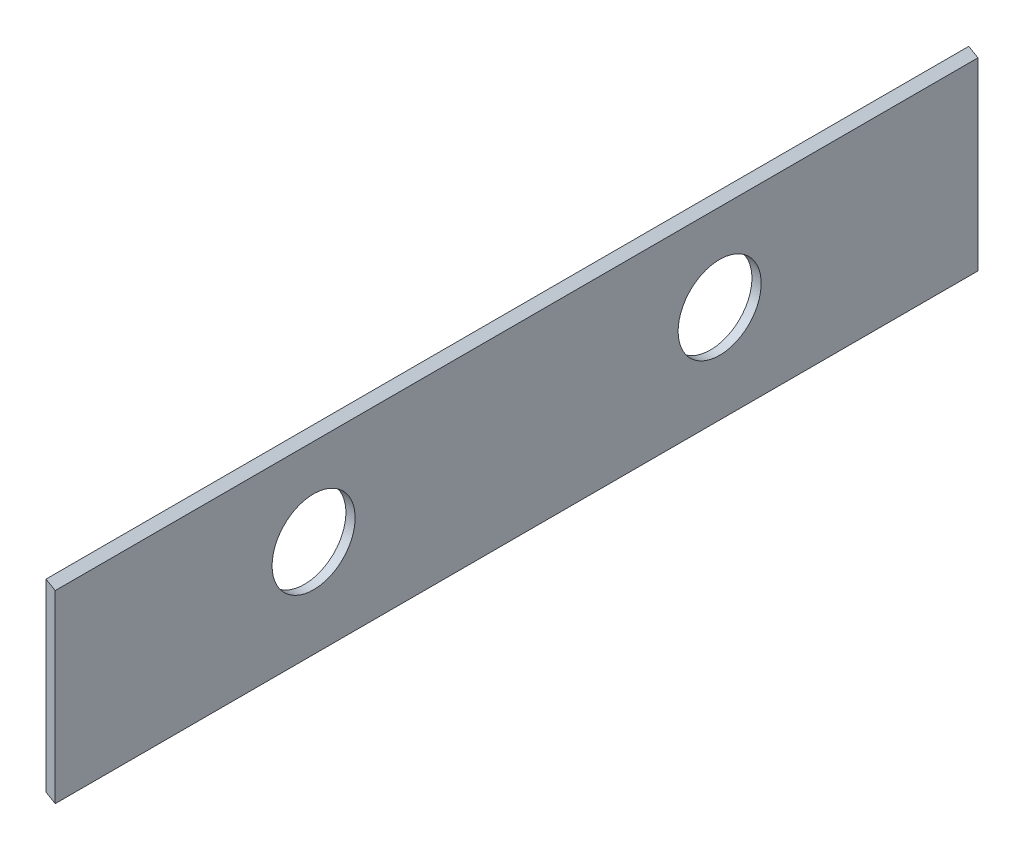
ISO-10303-21;
HEADER;
FILE_DESCRIPTION(('STEP AP214'),'2;1');
FILE_NAME('part.step','',(''),(''),'','','');
FILE_SCHEMA(('AUTOMOTIVE_DESIGN { 1 0 10303 214 1 1 1 1 }'));
ENDSEC;
DATA;
#1=APPLICATION_CONTEXT('core data for automotive mechanical design processes');
#2=APPLICATION_PROTOCOL_DEFINITION('international standard','automotive_design',2000,#1);
#3=PRODUCT_CONTEXT('',#1,'mechanical');
#4=PRODUCT('Part','Part','',(#3));
#5=PRODUCT_RELATED_PRODUCT_CATEGORY('part','',(#4));
#6=PRODUCT_DEFINITION_FORMATION('','',#4);
#7=PRODUCT_DEFINITION_CONTEXT('part definition',#1,'design');
#8=PRODUCT_DEFINITION('design','',#6,#7);
#9=PRODUCT_DEFINITION_SHAPE('','',#8);
#10=(LENGTH_UNIT() NAMED_UNIT(*) SI_UNIT(.MILLI.,.METRE.));
#11=(NAMED_UNIT(*) PLANE_ANGLE_UNIT() SI_UNIT($,.RADIAN.));
#12=(NAMED_UNIT(*) SI_UNIT($,.STERADIAN.) SOLID_ANGLE_UNIT());
#13=UNCERTAINTY_MEASURE_WITH_UNIT(LENGTH_MEASURE(1.E-05),#10,'distance_accuracy_value','');
#14=(GEOMETRIC_REPRESENTATION_CONTEXT(3) GLOBAL_UNCERTAINTY_ASSIGNED_CONTEXT((#13)) GLOBAL_UNIT_ASSIGNED_CONTEXT((#10,
#11,#12)) REPRESENTATION_CONTEXT('',''));
#15=CARTESIAN_POINT('',(0.,0.,0.));
#16=DIRECTION('',(0.,0.,1.));
#17=DIRECTION('',(1.,0.,0.));
#18=AXIS2_PLACEMENT_3D('',#15,#16,#17);
#19=CARTESIAN_POINT('',(-0.999999999999998,0.577350269189616,50.));
#20=DIRECTION('',(0.499999999999995,0.866025403784442,0.));
#21=DIRECTION('',(-0.866025403784442,0.499999999999995,0.));
#22=AXIS2_PLACEMENT_3D('',#19,#20,#21);
#23=PLANE('',#22);
#24=DIRECTION('',(0.866025403784442,-0.499999999999995,0.));
#25=VECTOR('',#24,1.);
#26=CARTESIAN_POINT('',(-0.999999999999998,0.577350269189616,-50.));
#27=LINE('',#26,#25);
#28=CARTESIAN_POINT('',(-0.999999999999998,0.577350269189616,-50.));
#29=VERTEX_POINT('',#28);
#30=CARTESIAN_POINT('',(0.,0.,-50.));
#31=VERTEX_POINT('',#30);
#32=EDGE_CURVE('E107',#29,#31,#27,.T.);
#33=ORIENTED_EDGE('',*,*,#32,.T.);
#34=DIRECTION('',(0.,0.,-1.));
#35=VECTOR('',#34,1.);
#36=CARTESIAN_POINT('',(0.,0.,50.));
#37=LINE('',#36,#35);
#38=CARTESIAN_POINT('',(0.,0.,50.));
#39=VERTEX_POINT('',#38);
#40=EDGE_CURVE('E11',#39,#31,#37,.T.);
#41=ORIENTED_EDGE('',*,*,#40,.F.);
#42=DIRECTION('',(0.866025403784442,-0.499999999999995,0.));
#43=VECTOR('',#42,1.);
#44=CARTESIAN_POINT('',(-0.999999999999998,0.577350269189616,50.));
#45=LINE('',#44,#43);
#46=CARTESIAN_POINT('',(-0.999999999999998,0.577350269189616,50.));
#47=VERTEX_POINT('',#46);
#48=EDGE_CURVE('E91',#47,#39,#45,.T.);
#49=ORIENTED_EDGE('',*,*,#48,.F.);
#50=DIRECTION('',(0.,0.,-1.));
#51=VECTOR('',#50,1.);
#52=CARTESIAN_POINT('',(-0.999999999999998,0.577350269189616,50.));
#53=LINE('',#52,#51);
#54=EDGE_CURVE('E103',#47,#29,#53,.T.);
#55=ORIENTED_EDGE('',*,*,#54,.T.);
#56=EDGE_LOOP('',(#33,#41,#49,#55));
#57=FACE_BOUND('',#56,.T.);
#58=ADVANCED_FACE('F39',(#57),#23,.F.);
#59=CARTESIAN_POINT('',(0.,0.,50.));
#60=DIRECTION('',(-1.,0.,0.));
#61=DIRECTION('',(0.,0.,1.));
#62=AXIS2_PLACEMENT_3D('',#59,#60,#61);
#63=PLANE('',#62);
#64=CARTESIAN_POINT('',(0.,10.5773502691896,-22.));
#65=DIRECTION('',(-1.,0.,0.));
#66=DIRECTION('',(0.,0.,1.));
#67=AXIS2_PLACEMENT_3D('',#64,#65,#66);
#68=CIRCLE('',#67,4.49999999999999);
#69=CARTESIAN_POINT('',(0.,10.5773502691896,-17.5));
#70=VERTEX_POINT('',#69);
#71=EDGE_CURVE('E135',#70,#70,#68,.T.);
#72=ORIENTED_EDGE('',*,*,#71,.T.);
#73=EDGE_LOOP('',(#72));
#74=FACE_BOUND('',#73,.T.);
#75=CARTESIAN_POINT('',(0.,10.5773502691896,22.));
#76=DIRECTION('',(-1.,0.,0.));
#77=DIRECTION('',(0.,0.,1.));
#78=AXIS2_PLACEMENT_3D('',#75,#76,#77);
#79=CIRCLE('',#78,4.49999999999999);
#80=CARTESIAN_POINT('',(0.,10.5773502691896,26.5));
#81=VERTEX_POINT('',#80);
#82=EDGE_CURVE('E111',#81,#81,#79,.T.);
#83=ORIENTED_EDGE('',*,*,#82,.T.);
#84=EDGE_LOOP('',(#83));
#85=FACE_BOUND('',#84,.T.);
#86=DIRECTION('',(0.,1.,0.));
#87=VECTOR('',#86,1.);
#88=CARTESIAN_POINT('',(0.,0.,-50.));
#89=LINE('',#88,#87);
#90=CARTESIAN_POINT('',(0.,20.,-50.));
#91=VERTEX_POINT('',#90);
#92=EDGE_CURVE('E96',#31,#91,#89,.T.);
#93=ORIENTED_EDGE('',*,*,#92,.T.);
#94=DIRECTION('',(0.,0.,-1.));
#95=VECTOR('',#94,1.);
#96=CARTESIAN_POINT('',(0.,20.,50.));
#97=LINE('',#96,#95);
#98=CARTESIAN_POINT('',(0.,20.,50.));
#99=VERTEX_POINT('',#98);
#100=EDGE_CURVE('E48',#99,#91,#97,.T.);
#101=ORIENTED_EDGE('',*,*,#100,.F.);
#102=DIRECTION('',(0.,1.,0.));
#103=VECTOR('',#102,1.);
#104=CARTESIAN_POINT('',(0.,0.,50.));
#105=LINE('',#104,#103);
#106=EDGE_CURVE('E86',#39,#99,#105,.T.);
#107=ORIENTED_EDGE('',*,*,#106,.F.);
#108=ORIENTED_EDGE('',*,*,#40,.T.);
#109=EDGE_LOOP('',(#93,#101,#107,#108));
#110=FACE_BOUND('',#109,.T.);
#111=ADVANCED_FACE('F95',(#74,#85,#110),#63,.F.);
#112=CARTESIAN_POINT('',(0.,20.,50.));
#113=DIRECTION('',(-0.499999999999993,-0.866025403784442,0.));
#114=DIRECTION('',(0.866025403784443,-0.499999999999993,0.));
#115=AXIS2_PLACEMENT_3D('',#112,#113,#114);
#116=PLANE('',#115);
#117=DIRECTION('',(-0.866025403784443,0.499999999999994,0.));
#118=VECTOR('',#117,1.);
#119=CARTESIAN_POINT('',(0.,20.,-50.));
#120=LINE('',#119,#118);
#121=CARTESIAN_POINT('',(-1.,20.5773502691896,-50.));
#122=VERTEX_POINT('',#121);
#123=EDGE_CURVE('E73',#91,#122,#120,.T.);
#124=ORIENTED_EDGE('',*,*,#123,.T.);
#125=DIRECTION('',(0.,0.,-1.));
#126=VECTOR('',#125,1.);
#127=CARTESIAN_POINT('',(-1.,20.5773502691896,50.));
#128=LINE('',#127,#126);
#129=CARTESIAN_POINT('',(-1.,20.5773502691896,50.));
#130=VERTEX_POINT('',#129);
#131=EDGE_CURVE('E98',#130,#122,#128,.T.);
#132=ORIENTED_EDGE('',*,*,#131,.F.);
#133=DIRECTION('',(-0.866025403784443,0.499999999999994,0.));
#134=VECTOR('',#133,1.);
#135=CARTESIAN_POINT('',(0.,20.,50.));
#136=LINE('',#135,#134);
#137=EDGE_CURVE('E89',#99,#130,#136,.T.);
#138=ORIENTED_EDGE('',*,*,#137,.F.);
#139=ORIENTED_EDGE('',*,*,#100,.T.);
#140=EDGE_LOOP('',(#124,#132,#138,#139));
#141=FACE_BOUND('',#140,.T.);
#142=ADVANCED_FACE('F99',(#141),#116,.F.);
#143=CARTESIAN_POINT('',(-1.,20.5773502691896,50.));
#144=DIRECTION('',(1.,0.,0.));
#145=DIRECTION('',(0.,1.,0.));
#146=AXIS2_PLACEMENT_3D('',#143,#144,#145);
#147=PLANE('',#146);
#148=CARTESIAN_POINT('',(-1.,10.5773502691896,-22.));
#149=DIRECTION('',(-1.,0.,0.));
#150=DIRECTION('',(0.,0.,1.));
#151=AXIS2_PLACEMENT_3D('',#148,#149,#150);
#152=CIRCLE('',#151,4.49999999999999);
#153=CARTESIAN_POINT('',(-1.,10.5773502691896,-17.5));
#154=VERTEX_POINT('',#153);
#155=EDGE_CURVE('E139',#154,#154,#152,.T.);
#156=ORIENTED_EDGE('',*,*,#155,.F.);
#157=EDGE_LOOP('',(#156));
#158=FACE_BOUND('',#157,.T.);
#159=CARTESIAN_POINT('',(-1.,10.5773502691896,22.));
#160=DIRECTION('',(-1.,0.,0.));
#161=DIRECTION('',(0.,0.,1.));
#162=AXIS2_PLACEMENT_3D('',#159,#160,#161);
#163=CIRCLE('',#162,4.49999999999999);
#164=CARTESIAN_POINT('',(-1.,10.5773502691896,26.5));
#165=VERTEX_POINT('',#164);
#166=EDGE_CURVE('E131',#165,#165,#163,.T.);
#167=ORIENTED_EDGE('',*,*,#166,.F.);
#168=EDGE_LOOP('',(#167));
#169=FACE_BOUND('',#168,.T.);
#170=DIRECTION('',(0.,-1.,0.));
#171=VECTOR('',#170,1.);
#172=CARTESIAN_POINT('',(-1.,20.5773502691896,-50.));
#173=LINE('',#172,#171);
#174=EDGE_CURVE('E79',#122,#29,#173,.T.);
#175=ORIENTED_EDGE('',*,*,#174,.T.);
#176=ORIENTED_EDGE('',*,*,#54,.F.);
#177=DIRECTION('',(0.,-1.,0.));
#178=VECTOR('',#177,1.);
#179=CARTESIAN_POINT('',(-1.,20.5773502691896,50.));
#180=LINE('',#179,#178);
#181=EDGE_CURVE('E56',#130,#47,#180,.T.);
#182=ORIENTED_EDGE('',*,*,#181,.F.);
#183=ORIENTED_EDGE('',*,*,#131,.T.);
#184=EDGE_LOOP('',(#175,#176,#182,#183));
#185=FACE_BOUND('',#184,.T.);
#186=ADVANCED_FACE('F121',(#158,#169,#185),#147,.F.);
#187=CARTESIAN_POINT('',(0.,0.,50.));
#188=DIRECTION('',(0.,0.,1.));
#189=DIRECTION('',(1.,0.,0.));
#190=AXIS2_PLACEMENT_3D('',#187,#188,#189);
#191=PLANE('',#190);
#192=ORIENTED_EDGE('',*,*,#48,.T.);
#193=ORIENTED_EDGE('',*,*,#106,.T.);
#194=ORIENTED_EDGE('',*,*,#137,.T.);
#195=ORIENTED_EDGE('',*,*,#181,.T.);
#196=EDGE_LOOP('',(#192,#193,#194,#195));
#197=FACE_BOUND('',#196,.T.);
#198=ADVANCED_FACE('F87',(#197),#191,.T.);
#199=CARTESIAN_POINT('',(0.,0.,-50.));
#200=DIRECTION('',(0.,0.,1.));
#201=DIRECTION('',(1.,0.,0.));
#202=AXIS2_PLACEMENT_3D('',#199,#200,#201);
#203=PLANE('',#202);
#204=ORIENTED_EDGE('',*,*,#32,.F.);
#205=ORIENTED_EDGE('',*,*,#174,.F.);
#206=ORIENTED_EDGE('',*,*,#123,.F.);
#207=ORIENTED_EDGE('',*,*,#92,.F.);
#208=EDGE_LOOP('',(#204,#205,#206,#207));
#209=FACE_BOUND('',#208,.T.);
#210=ADVANCED_FACE('F124',(#209),#203,.F.);
#211=CARTESIAN_POINT('',(-1.,10.5773502691896,22.));
#212=DIRECTION('',(-1.,0.,0.));
#213=DIRECTION('',(0.,0.,1.));
#214=AXIS2_PLACEMENT_3D('',#211,#212,#213);
#215=CYLINDRICAL_SURFACE('',#214,4.49999999999999);
#216=ORIENTED_EDGE('',*,*,#166,.T.);
#217=EDGE_LOOP('',(#216));
#218=FACE_BOUND('',#217,.T.);
#219=ORIENTED_EDGE('',*,*,#82,.F.);
#220=EDGE_LOOP('',(#219));
#221=FACE_BOUND('',#220,.T.);
#222=ADVANCED_FACE('F152',(#218,#221),#215,.F.);
#223=CARTESIAN_POINT('',(-1.,10.5773502691896,-22.));
#224=DIRECTION('',(-1.,0.,0.));
#225=DIRECTION('',(0.,0.,1.));
#226=AXIS2_PLACEMENT_3D('',#223,#224,#225);
#227=CYLINDRICAL_SURFACE('',#226,4.49999999999999);
#228=ORIENTED_EDGE('',*,*,#155,.T.);
#229=EDGE_LOOP('',(#228));
#230=FACE_BOUND('',#229,.T.);
#231=ORIENTED_EDGE('',*,*,#71,.F.);
#232=EDGE_LOOP('',(#231));
#233=FACE_BOUND('',#232,.T.);
#234=ADVANCED_FACE('F144',(#230,#233),#227,.F.);
#235=CLOSED_SHELL('',(#58,#111,#142,#186,#198,#210,#222,#234));
#236=MANIFOLD_SOLID_BREP('B2',#235);
#237=ADVANCED_BREP_SHAPE_REPRESENTATION('',(#18,#236),#14);
#238=SHAPE_DEFINITION_REPRESENTATION(#9,#237);
ENDSEC;
END-ISO-10303-21;
